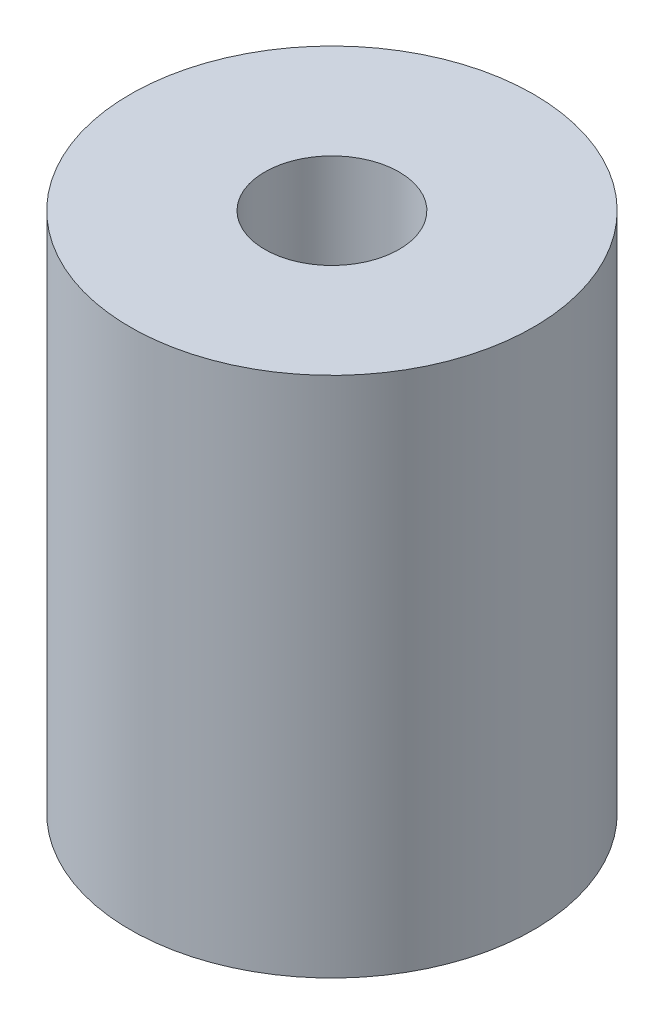
ISO-10303-21;
HEADER;
FILE_DESCRIPTION(('STEP AP214'),'2;1');
FILE_NAME('part.step','',(''),(''),'','','');
FILE_SCHEMA(('AUTOMOTIVE_DESIGN { 1 0 10303 214 1 1 1 1 }'));
ENDSEC;
DATA;
#1=APPLICATION_CONTEXT('core data for automotive mechanical design processes');
#2=APPLICATION_PROTOCOL_DEFINITION('international standard','automotive_design',2000,#1);
#3=PRODUCT_CONTEXT('',#1,'mechanical');
#4=PRODUCT('Part','Part','',(#3));
#5=PRODUCT_RELATED_PRODUCT_CATEGORY('part','',(#4));
#6=PRODUCT_DEFINITION_FORMATION('','',#4);
#7=PRODUCT_DEFINITION_CONTEXT('part definition',#1,'design');
#8=PRODUCT_DEFINITION('design','',#6,#7);
#9=PRODUCT_DEFINITION_SHAPE('','',#8);
#10=(LENGTH_UNIT() NAMED_UNIT(*) SI_UNIT(.MILLI.,.METRE.));
#11=(NAMED_UNIT(*) PLANE_ANGLE_UNIT() SI_UNIT($,.RADIAN.));
#12=(NAMED_UNIT(*) SI_UNIT($,.STERADIAN.) SOLID_ANGLE_UNIT());
#13=UNCERTAINTY_MEASURE_WITH_UNIT(LENGTH_MEASURE(1.E-05),#10,'distance_accuracy_value','');
#14=(GEOMETRIC_REPRESENTATION_CONTEXT(3) GLOBAL_UNCERTAINTY_ASSIGNED_CONTEXT((#13)) GLOBAL_UNIT_ASSIGNED_CONTEXT((#10,
#11,#12)) REPRESENTATION_CONTEXT('',''));
#15=CARTESIAN_POINT('',(0.,0.,0.));
#16=DIRECTION('',(0.,0.,1.));
#17=DIRECTION('',(1.,0.,0.));
#18=AXIS2_PLACEMENT_3D('',#15,#16,#17);
#19=CARTESIAN_POINT('',(10.1397182634839,7.7724,0.788352622063243));
#20=DIRECTION('',(0.,1.,0.));
#21=DIRECTION('',(0.,0.,1.));
#22=AXIS2_PLACEMENT_3D('',#19,#20,#21);
#23=PLANE('',#22);
#24=CARTESIAN_POINT('',(10.1397182634839,7.7724,0.788352622063243));
#25=DIRECTION('',(0.,1.,0.));
#26=DIRECTION('',(0.,0.,1.));
#27=AXIS2_PLACEMENT_3D('',#24,#25,#26);
#28=CIRCLE('',#27,6.0071);
#29=CARTESIAN_POINT('',(10.1397182634839,7.7724,-5.21874737793676));
#30=VERTEX_POINT('',#29);
#31=EDGE_CURVE('E10',#30,#30,#28,.T.);
#32=ORIENTED_EDGE('',*,*,#31,.T.);
#33=EDGE_LOOP('',(#32));
#34=FACE_BOUND('',#33,.T.);
#35=CARTESIAN_POINT('',(10.1397182634839,7.7724,0.788352622063243));
#36=DIRECTION('',(0.,1.,0.));
#37=DIRECTION('',(0.,0.,1.));
#38=AXIS2_PLACEMENT_3D('',#35,#36,#37);
#39=CIRCLE('',#38,2.00025);
#40=CARTESIAN_POINT('',(10.1397182634839,7.7724,-1.21189737793676));
#41=VERTEX_POINT('',#40);
#42=EDGE_CURVE('E42',#41,#41,#39,.T.);
#43=ORIENTED_EDGE('',*,*,#42,.F.);
#44=EDGE_LOOP('',(#43));
#45=FACE_BOUND('',#44,.T.);
#46=ADVANCED_FACE('F31',(#34,#45),#23,.T.);
#47=CARTESIAN_POINT('',(10.1397182634839,-7.7724,0.788352622063243));
#48=DIRECTION('',(0.,1.,0.));
#49=DIRECTION('',(0.,0.,1.));
#50=AXIS2_PLACEMENT_3D('',#47,#48,#49);
#51=PLANE('',#50);
#52=CARTESIAN_POINT('',(10.1397182634839,-7.7724,0.788352622063243));
#53=DIRECTION('',(0.,1.,0.));
#54=DIRECTION('',(0.,0.,1.));
#55=AXIS2_PLACEMENT_3D('',#52,#53,#54);
#56=CIRCLE('',#55,6.0071);
#57=CARTESIAN_POINT('',(10.1397182634839,-7.7724,-5.21874737793676));
#58=VERTEX_POINT('',#57);
#59=EDGE_CURVE('E35',#58,#58,#56,.T.);
#60=ORIENTED_EDGE('',*,*,#59,.F.);
#61=EDGE_LOOP('',(#60));
#62=FACE_BOUND('',#61,.T.);
#63=CARTESIAN_POINT('',(10.1397182634839,-7.7724,0.788352622063243));
#64=DIRECTION('',(0.,1.,0.));
#65=DIRECTION('',(0.,0.,1.));
#66=AXIS2_PLACEMENT_3D('',#63,#64,#65);
#67=CIRCLE('',#66,2.00025);
#68=CARTESIAN_POINT('',(10.1397182634839,-7.7724,-1.21189737793676));
#69=VERTEX_POINT('',#68);
#70=EDGE_CURVE('E44',#69,#69,#67,.T.);
#71=ORIENTED_EDGE('',*,*,#70,.T.);
#72=EDGE_LOOP('',(#71));
#73=FACE_BOUND('',#72,.T.);
#74=ADVANCED_FACE('F54',(#62,#73),#51,.F.);
#75=CARTESIAN_POINT('',(10.1397182634839,7.7724,0.788352622063243));
#76=DIRECTION('',(0.,-1.,0.));
#77=DIRECTION('',(0.,0.,-1.));
#78=AXIS2_PLACEMENT_3D('',#75,#76,#77);
#79=CYLINDRICAL_SURFACE('',#78,6.0071);
#80=CARTESIAN_POINT('',(10.1397182634839,7.7724,-5.21874737793676));
#81=CARTESIAN_POINT('',(10.1397182634839,7.610475,-5.21874737793676));
#82=CARTESIAN_POINT('',(10.1397182634839,7.44855,-5.21874737793676));
#83=CARTESIAN_POINT('',(10.1397182634839,7.1247,-5.21874737793676));
#84=CARTESIAN_POINT('',(10.1397182634839,6.962775,-5.21874737793676));
#85=CARTESIAN_POINT('',(10.1397182634839,6.638925,-5.21874737793676));
#86=CARTESIAN_POINT('',(10.1397182634839,6.477,-5.21874737793676));
#87=CARTESIAN_POINT('',(10.1397182634839,6.15315,-5.21874737793676));
#88=CARTESIAN_POINT('',(10.1397182634839,5.991225,-5.21874737793676));
#89=CARTESIAN_POINT('',(10.1397182634839,5.667375,-5.21874737793676));
#90=CARTESIAN_POINT('',(10.1397182634839,5.50545,-5.21874737793676));
#91=CARTESIAN_POINT('',(10.1397182634839,5.1816,-5.21874737793676));
#92=CARTESIAN_POINT('',(10.1397182634839,5.019675,-5.21874737793676));
#93=CARTESIAN_POINT('',(10.1397182634839,4.695825,-5.21874737793676));
#94=CARTESIAN_POINT('',(10.1397182634839,4.5339,-5.21874737793676));
#95=CARTESIAN_POINT('',(10.1397182634839,4.21005,-5.21874737793676));
#96=CARTESIAN_POINT('',(10.1397182634839,4.048125,-5.21874737793676));
#97=CARTESIAN_POINT('',(10.1397182634839,3.724275,-5.21874737793676));
#98=CARTESIAN_POINT('',(10.1397182634839,3.56235,-5.21874737793676));
#99=CARTESIAN_POINT('',(10.1397182634839,3.2385,-5.21874737793676));
#100=CARTESIAN_POINT('',(10.1397182634839,3.076575,-5.21874737793676));
#101=CARTESIAN_POINT('',(10.1397182634839,2.752725,-5.21874737793676));
#102=CARTESIAN_POINT('',(10.1397182634839,2.5908,-5.21874737793676));
#103=CARTESIAN_POINT('',(10.1397182634839,2.26695,-5.21874737793676));
#104=CARTESIAN_POINT('',(10.1397182634839,2.105025,-5.21874737793676));
#105=CARTESIAN_POINT('',(10.1397182634839,1.781175,-5.21874737793676));
#106=CARTESIAN_POINT('',(10.1397182634839,1.61925,-5.21874737793676));
#107=CARTESIAN_POINT('',(10.1397182634839,1.2954,-5.21874737793676));
#108=CARTESIAN_POINT('',(10.1397182634839,1.133475,-5.21874737793676));
#109=CARTESIAN_POINT('',(10.1397182634839,0.809624999999999,-5.21874737793676));
#110=CARTESIAN_POINT('',(10.1397182634839,0.647699999999999,-5.21874737793676));
#111=CARTESIAN_POINT('',(10.1397182634839,0.323849999999999,-5.21874737793676));
#112=CARTESIAN_POINT('',(10.1397182634839,0.161924999999999,-5.21874737793676));
#113=CARTESIAN_POINT('',(10.1397182634839,-0.161925000000001,-5.21874737793676));
#114=CARTESIAN_POINT('',(10.1397182634839,-0.32385,-5.21874737793676));
#115=CARTESIAN_POINT('',(10.1397182634839,-0.6477,-5.21874737793676));
#116=CARTESIAN_POINT('',(10.1397182634839,-0.809624999999999,-5.21874737793676));
#117=CARTESIAN_POINT('',(10.1397182634839,-1.133475,-5.21874737793676));
#118=CARTESIAN_POINT('',(10.1397182634839,-1.2954,-5.21874737793676));
#119=CARTESIAN_POINT('',(10.1397182634839,-1.61925,-5.21874737793676));
#120=CARTESIAN_POINT('',(10.1397182634839,-1.781175,-5.21874737793676));
#121=CARTESIAN_POINT('',(10.1397182634839,-2.105025,-5.21874737793676));
#122=CARTESIAN_POINT('',(10.1397182634839,-2.26695,-5.21874737793676));
#123=CARTESIAN_POINT('',(10.1397182634839,-2.5908,-5.21874737793676));
#124=CARTESIAN_POINT('',(10.1397182634839,-2.752725,-5.21874737793676));
#125=CARTESIAN_POINT('',(10.1397182634839,-3.076575,-5.21874737793676));
#126=CARTESIAN_POINT('',(10.1397182634839,-3.2385,-5.21874737793676));
#127=CARTESIAN_POINT('',(10.1397182634839,-3.56235,-5.21874737793676));
#128=CARTESIAN_POINT('',(10.1397182634839,-3.724275,-5.21874737793676));
#129=CARTESIAN_POINT('',(10.1397182634839,-4.048125,-5.21874737793676));
#130=CARTESIAN_POINT('',(10.1397182634839,-4.21005,-5.21874737793676));
#131=CARTESIAN_POINT('',(10.1397182634839,-4.5339,-5.21874737793676));
#132=CARTESIAN_POINT('',(10.1397182634839,-4.695825,-5.21874737793676));
#133=CARTESIAN_POINT('',(10.1397182634839,-5.019675,-5.21874737793676));
#134=CARTESIAN_POINT('',(10.1397182634839,-5.1816,-5.21874737793676));
#135=CARTESIAN_POINT('',(10.1397182634839,-5.50545,-5.21874737793676));
#136=CARTESIAN_POINT('',(10.1397182634839,-5.667375,-5.21874737793676));
#137=CARTESIAN_POINT('',(10.1397182634839,-5.991225,-5.21874737793676));
#138=CARTESIAN_POINT('',(10.1397182634839,-6.15315,-5.21874737793676));
#139=CARTESIAN_POINT('',(10.1397182634839,-6.477,-5.21874737793676));
#140=CARTESIAN_POINT('',(10.1397182634839,-6.638925,-5.21874737793676));
#141=CARTESIAN_POINT('',(10.1397182634839,-6.962775,-5.21874737793676));
#142=CARTESIAN_POINT('',(10.1397182634839,-7.1247,-5.21874737793676));
#143=CARTESIAN_POINT('',(10.1397182634839,-7.44855,-5.21874737793676));
#144=CARTESIAN_POINT('',(10.1397182634839,-7.610475,-5.21874737793676));
#145=CARTESIAN_POINT('',(10.1397182634839,-7.7724,-5.21874737793676));
#146=B_SPLINE_CURVE_WITH_KNOTS('',3,(#80,#81,#82,#83,#84,#85,#86,#87,#88,#89,#90,#91,#92,#93,
#94,#95,#96,#97,#98,#99,#100,#101,#102,#103,#104,#105,#106,#107,#108,#109,#110,#111,#112,#113,
#114,#115,#116,#117,#118,#119,#120,#121,#122,#123,#124,#125,#126,#127,#128,#129,#130,#131,#132,
#133,#134,#135,#136,#137,#138,#139,#140,#141,#142,#143,#144,#145),.UNSPECIFIED.,.F.,.F.,(4,2,2,
2,2,2,2,2,2,2,2,2,2,2,2,2,2,2,2,2,2,2,2,2,2,2,2,2,2,2,2,2,4),(0.,0.485775,0.97155,1.457325,
1.9431,2.428875,2.91465,3.400425,3.8862,4.371975,4.85775,5.343525,5.8293,6.315075,6.80085,
7.286625,7.7724,8.258175,8.74395,9.229725,9.7155,10.201275,10.68705,11.172825,11.6586,12.144375,
12.63015,13.115925,13.6017,14.087475,14.57325,15.059025,15.5448),.UNSPECIFIED.);
#147=EDGE_CURVE('BSEAM33',#30,#58,#146,.T.);
#148=ORIENTED_EDGE('',*,*,#31,.F.);
#149=ORIENTED_EDGE('',*,*,#59,.T.);
#150=ORIENTED_EDGE('',*,*,#147,.T.);
#151=ORIENTED_EDGE('',*,*,#147,.F.);
#152=EDGE_LOOP('',(#148,#150,#149,#151));
#153=FACE_BOUND('',#152,.T.);
#154=ADVANCED_FACE('F33',(#153),#79,.T.);
#155=CARTESIAN_POINT('',(10.1397182634839,7.7724,0.788352622063243));
#156=DIRECTION('',(0.,-1.,0.));
#157=DIRECTION('',(0.,0.,-1.));
#158=AXIS2_PLACEMENT_3D('',#155,#156,#157);
#159=CYLINDRICAL_SURFACE('',#158,2.00025);
#160=CARTESIAN_POINT('',(10.1397182634839,7.7724,-1.21189737793676));
#161=CARTESIAN_POINT('',(10.1397182634839,7.610475,-1.21189737793676));
#162=CARTESIAN_POINT('',(10.1397182634839,7.44855,-1.21189737793676));
#163=CARTESIAN_POINT('',(10.1397182634839,7.1247,-1.21189737793676));
#164=CARTESIAN_POINT('',(10.1397182634839,6.962775,-1.21189737793676));
#165=CARTESIAN_POINT('',(10.1397182634839,6.638925,-1.21189737793676));
#166=CARTESIAN_POINT('',(10.1397182634839,6.477,-1.21189737793676));
#167=CARTESIAN_POINT('',(10.1397182634839,6.15315,-1.21189737793676));
#168=CARTESIAN_POINT('',(10.1397182634839,5.991225,-1.21189737793676));
#169=CARTESIAN_POINT('',(10.1397182634839,5.667375,-1.21189737793676));
#170=CARTESIAN_POINT('',(10.1397182634839,5.50545,-1.21189737793676));
#171=CARTESIAN_POINT('',(10.1397182634839,5.1816,-1.21189737793676));
#172=CARTESIAN_POINT('',(10.1397182634839,5.019675,-1.21189737793676));
#173=CARTESIAN_POINT('',(10.1397182634839,4.695825,-1.21189737793676));
#174=CARTESIAN_POINT('',(10.1397182634839,4.5339,-1.21189737793676));
#175=CARTESIAN_POINT('',(10.1397182634839,4.21005,-1.21189737793676));
#176=CARTESIAN_POINT('',(10.1397182634839,4.048125,-1.21189737793676));
#177=CARTESIAN_POINT('',(10.1397182634839,3.724275,-1.21189737793676));
#178=CARTESIAN_POINT('',(10.1397182634839,3.56235,-1.21189737793676));
#179=CARTESIAN_POINT('',(10.1397182634839,3.2385,-1.21189737793676));
#180=CARTESIAN_POINT('',(10.1397182634839,3.076575,-1.21189737793676));
#181=CARTESIAN_POINT('',(10.1397182634839,2.752725,-1.21189737793676));
#182=CARTESIAN_POINT('',(10.1397182634839,2.5908,-1.21189737793676));
#183=CARTESIAN_POINT('',(10.1397182634839,2.26695,-1.21189737793676));
#184=CARTESIAN_POINT('',(10.1397182634839,2.105025,-1.21189737793676));
#185=CARTESIAN_POINT('',(10.1397182634839,1.781175,-1.21189737793676));
#186=CARTESIAN_POINT('',(10.1397182634839,1.61925,-1.21189737793676));
#187=CARTESIAN_POINT('',(10.1397182634839,1.2954,-1.21189737793676));
#188=CARTESIAN_POINT('',(10.1397182634839,1.133475,-1.21189737793676));
#189=CARTESIAN_POINT('',(10.1397182634839,0.809625,-1.21189737793676));
#190=CARTESIAN_POINT('',(10.1397182634839,0.6477,-1.21189737793676));
#191=CARTESIAN_POINT('',(10.1397182634839,0.32385,-1.21189737793676));
#192=CARTESIAN_POINT('',(10.1397182634839,0.161925,-1.21189737793676));
#193=CARTESIAN_POINT('',(10.1397182634839,-0.161925,-1.21189737793676));
#194=CARTESIAN_POINT('',(10.1397182634839,-0.32385,-1.21189737793676));
#195=CARTESIAN_POINT('',(10.1397182634839,-0.647699999999999,-1.21189737793676));
#196=CARTESIAN_POINT('',(10.1397182634839,-0.809624999999999,-1.21189737793676));
#197=CARTESIAN_POINT('',(10.1397182634839,-1.133475,-1.21189737793676));
#198=CARTESIAN_POINT('',(10.1397182634839,-1.2954,-1.21189737793676));
#199=CARTESIAN_POINT('',(10.1397182634839,-1.61925,-1.21189737793676));
#200=CARTESIAN_POINT('',(10.1397182634839,-1.781175,-1.21189737793676));
#201=CARTESIAN_POINT('',(10.1397182634839,-2.105025,-1.21189737793676));
#202=CARTESIAN_POINT('',(10.1397182634839,-2.26695,-1.21189737793676));
#203=CARTESIAN_POINT('',(10.1397182634839,-2.5908,-1.21189737793676));
#204=CARTESIAN_POINT('',(10.1397182634839,-2.752725,-1.21189737793676));
#205=CARTESIAN_POINT('',(10.1397182634839,-3.076575,-1.21189737793676));
#206=CARTESIAN_POINT('',(10.1397182634839,-3.2385,-1.21189737793676));
#207=CARTESIAN_POINT('',(10.1397182634839,-3.56235,-1.21189737793676));
#208=CARTESIAN_POINT('',(10.1397182634839,-3.724275,-1.21189737793676));
#209=CARTESIAN_POINT('',(10.1397182634839,-4.048125,-1.21189737793676));
#210=CARTESIAN_POINT('',(10.1397182634839,-4.21005,-1.21189737793676));
#211=CARTESIAN_POINT('',(10.1397182634839,-4.5339,-1.21189737793676));
#212=CARTESIAN_POINT('',(10.1397182634839,-4.695825,-1.21189737793676));
#213=CARTESIAN_POINT('',(10.1397182634839,-5.019675,-1.21189737793676));
#214=CARTESIAN_POINT('',(10.1397182634839,-5.1816,-1.21189737793676));
#215=CARTESIAN_POINT('',(10.1397182634839,-5.50545,-1.21189737793676));
#216=CARTESIAN_POINT('',(10.1397182634839,-5.667375,-1.21189737793676));
#217=CARTESIAN_POINT('',(10.1397182634839,-5.991225,-1.21189737793676));
#218=CARTESIAN_POINT('',(10.1397182634839,-6.15315,-1.21189737793676));
#219=CARTESIAN_POINT('',(10.1397182634839,-6.477,-1.21189737793676));
#220=CARTESIAN_POINT('',(10.1397182634839,-6.638925,-1.21189737793676));
#221=CARTESIAN_POINT('',(10.1397182634839,-6.962775,-1.21189737793676));
#222=CARTESIAN_POINT('',(10.1397182634839,-7.1247,-1.21189737793676));
#223=CARTESIAN_POINT('',(10.1397182634839,-7.44855,-1.21189737793676));
#224=CARTESIAN_POINT('',(10.1397182634839,-7.610475,-1.21189737793676));
#225=CARTESIAN_POINT('',(10.1397182634839,-7.7724,-1.21189737793676));
#226=B_SPLINE_CURVE_WITH_KNOTS('',3,(#160,#161,#162,#163,#164,#165,#166,#167,#168,#169,#170,
#171,#172,#173,#174,#175,#176,#177,#178,#179,#180,#181,#182,#183,#184,#185,#186,#187,#188,#189,
#190,#191,#192,#193,#194,#195,#196,#197,#198,#199,#200,#201,#202,#203,#204,#205,#206,#207,#208,
#209,#210,#211,#212,#213,#214,#215,#216,#217,#218,#219,#220,#221,#222,#223,#224,#225),
.UNSPECIFIED.,.F.,.F.,(4,2,2,2,2,2,2,2,2,2,2,2,2,2,2,2,2,2,2,2,2,2,2,2,2,2,2,2,2,2,2,2,4),(0.,
0.485775000000001,0.971550000000001,1.457325,1.9431,2.428875,2.91465,3.400425,3.8862,4.371975,
4.85775,5.343525,5.8293,6.315075,6.80085,7.286625,7.7724,8.258175,8.74395,9.229725,9.7155,
10.201275,10.68705,11.172825,11.6586,12.144375,12.63015,13.115925,13.6017,14.087475,14.57325,
15.059025,15.5448),.UNSPECIFIED.);
#227=EDGE_CURVE('BSEAM50',#41,#69,#226,.T.);
#228=ORIENTED_EDGE('',*,*,#42,.T.);
#229=ORIENTED_EDGE('',*,*,#70,.F.);
#230=ORIENTED_EDGE('',*,*,#227,.T.);
#231=ORIENTED_EDGE('',*,*,#227,.F.);
#232=EDGE_LOOP('',(#228,#230,#229,#231));
#233=FACE_BOUND('',#232,.T.);
#234=ADVANCED_FACE('F50',(#233),#159,.F.);
#235=CLOSED_SHELL('',(#46,#74,#154,#234));
#236=MANIFOLD_SOLID_BREP('B2',#235);
#237=ADVANCED_BREP_SHAPE_REPRESENTATION('',(#18,#236),#14);
#238=SHAPE_DEFINITION_REPRESENTATION(#9,#237);
ENDSEC;
END-ISO-10303-21;
